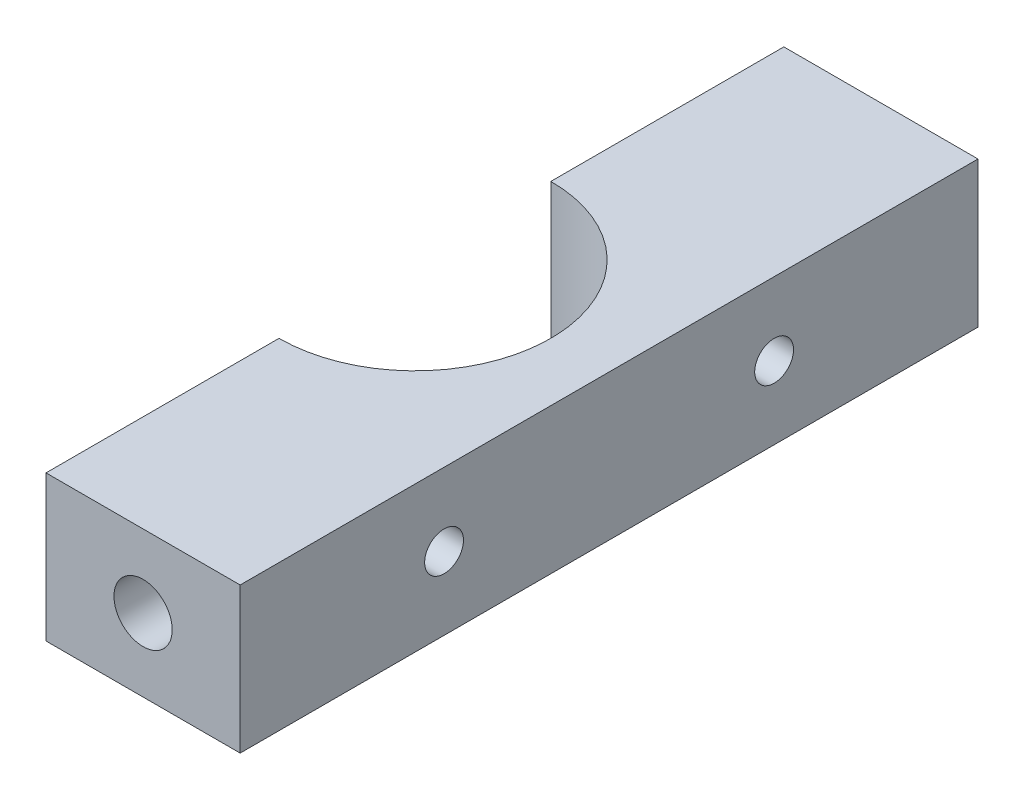
ISO-10303-21;
HEADER;
FILE_DESCRIPTION(('STEP AP214'),'2;1');
FILE_NAME('part.step','',(''),(''),'','','');
FILE_SCHEMA(('AUTOMOTIVE_DESIGN { 1 0 10303 214 1 1 1 1 }'));
ENDSEC;
DATA;
#1=APPLICATION_CONTEXT('core data for automotive mechanical design processes');
#2=APPLICATION_PROTOCOL_DEFINITION('international standard','automotive_design',2000,#1);
#3=PRODUCT_CONTEXT('',#1,'mechanical');
#4=PRODUCT('Part','Part','',(#3));
#5=PRODUCT_RELATED_PRODUCT_CATEGORY('part','',(#4));
#6=PRODUCT_DEFINITION_FORMATION('','',#4);
#7=PRODUCT_DEFINITION_CONTEXT('part definition',#1,'design');
#8=PRODUCT_DEFINITION('design','',#6,#7);
#9=PRODUCT_DEFINITION_SHAPE('','',#8);
#10=(LENGTH_UNIT() NAMED_UNIT(*) SI_UNIT(.MILLI.,.METRE.));
#11=(NAMED_UNIT(*) PLANE_ANGLE_UNIT() SI_UNIT($,.RADIAN.));
#12=(NAMED_UNIT(*) SI_UNIT($,.STERADIAN.) SOLID_ANGLE_UNIT());
#13=UNCERTAINTY_MEASURE_WITH_UNIT(LENGTH_MEASURE(1.E-05),#10,'distance_accuracy_value','');
#14=(GEOMETRIC_REPRESENTATION_CONTEXT(3) GLOBAL_UNCERTAINTY_ASSIGNED_CONTEXT((#13)) GLOBAL_UNIT_ASSIGNED_CONTEXT((#10,
#11,#12)) REPRESENTATION_CONTEXT('',''));
#15=CARTESIAN_POINT('',(0.,0.,0.));
#16=DIRECTION('',(0.,0.,1.));
#17=DIRECTION('',(1.,0.,0.));
#18=AXIS2_PLACEMENT_3D('',#15,#16,#17);
#19=CARTESIAN_POINT('',(20.0000999096368,15.,-38.0000000000109));
#20=DIRECTION('',(0.,0.,1.));
#21=DIRECTION('',(1.,0.,0.));
#22=AXIS2_PLACEMENT_3D('',#19,#20,#21);
#23=PLANE('',#22);
#24=DIRECTION('',(-1.,0.,0.));
#25=VECTOR('',#24,1.);
#26=CARTESIAN_POINT('',(20.0000999096368,0.,-38.0000000000109));
#27=LINE('',#26,#25);
#28=CARTESIAN_POINT('',(20.0000999096368,0.,-38.0000000000109));
#29=VERTEX_POINT('',#28);
#30=CARTESIAN_POINT('',(-4.94881913226664E-10,0.,-38.0000000000109));
#31=VERTEX_POINT('',#30);
#32=EDGE_CURVE('E124',#29,#31,#27,.T.);
#33=ORIENTED_EDGE('',*,*,#32,.T.);
#34=DIRECTION('',(0.,-1.,0.));
#35=VECTOR('',#34,1.);
#36=CARTESIAN_POINT('',(-4.94881913226664E-10,15.,-38.0000000000109));
#37=LINE('',#36,#35);
#38=CARTESIAN_POINT('',(-4.94881913226664E-10,15.,-38.0000000000109));
#39=VERTEX_POINT('',#38);
#40=EDGE_CURVE('E109',#39,#31,#37,.T.);
#41=ORIENTED_EDGE('',*,*,#40,.F.);
#42=DIRECTION('',(-1.,0.,0.));
#43=VECTOR('',#42,1.);
#44=CARTESIAN_POINT('',(20.0000999096368,15.,-38.0000000000109));
#45=LINE('',#44,#43);
#46=CARTESIAN_POINT('',(20.0000999096368,15.,-38.0000000000109));
#47=VERTEX_POINT('',#46);
#48=EDGE_CURVE('E100',#47,#39,#45,.T.);
#49=ORIENTED_EDGE('',*,*,#48,.F.);
#50=DIRECTION('',(0.,-1.,0.));
#51=VECTOR('',#50,1.);
#52=CARTESIAN_POINT('',(20.0000999096368,15.,-38.0000000000109));
#53=LINE('',#52,#51);
#54=EDGE_CURVE('E41',#47,#29,#53,.T.);
#55=ORIENTED_EDGE('',*,*,#54,.T.);
#56=EDGE_LOOP('',(#33,#41,#49,#55));
#57=FACE_BOUND('',#56,.T.);
#58=CARTESIAN_POINT('',(9.99999999950687,7.50000000000001,-38.0000000000109));
#59=DIRECTION('',(0.,0.,1.));
#60=DIRECTION('',(1.,0.,0.));
#61=AXIS2_PLACEMENT_3D('',#58,#59,#60);
#62=CIRCLE('',#61,3.);
#63=CARTESIAN_POINT('',(12.9999999995069,7.50000000000001,-38.0000000000109));
#64=VERTEX_POINT('',#63);
#65=EDGE_CURVE('E221',#64,#64,#62,.T.);
#66=ORIENTED_EDGE('',*,*,#65,.T.);
#67=EDGE_LOOP('',(#66));
#68=FACE_BOUND('',#67,.T.);
#69=ADVANCED_FACE('F31',(#57,#68),#23,.F.);
#70=CARTESIAN_POINT('',(-4.94895804792448E-10,15.,38.0000000000091));
#71=DIRECTION('',(0.,0.,-1.));
#72=DIRECTION('',(-1.,0.,0.));
#73=AXIS2_PLACEMENT_3D('',#70,#71,#72);
#74=PLANE('',#73);
#75=CARTESIAN_POINT('',(10.,7.5,38.0000000000091));
#76=DIRECTION('',(0.,0.,1.));
#77=DIRECTION('',(1.,0.,0.));
#78=AXIS2_PLACEMENT_3D('',#75,#76,#77);
#79=CIRCLE('',#78,3.);
#80=CARTESIAN_POINT('',(13.,7.5,38.0000000000091));
#81=VERTEX_POINT('',#80);
#82=EDGE_CURVE('E148',#81,#81,#79,.T.);
#83=ORIENTED_EDGE('',*,*,#82,.F.);
#84=EDGE_LOOP('',(#83));
#85=FACE_BOUND('',#84,.T.);
#86=DIRECTION('',(1.,0.,0.));
#87=VECTOR('',#86,1.);
#88=CARTESIAN_POINT('',(-4.94895804792448E-10,0.,38.0000000000091));
#89=LINE('',#88,#87);
#90=CARTESIAN_POINT('',(-4.94895804792448E-10,0.,38.0000000000091));
#91=VERTEX_POINT('',#90);
#92=CARTESIAN_POINT('',(20.0000999096368,0.,38.0000000000091));
#93=VERTEX_POINT('',#92);
#94=EDGE_CURVE('E118',#91,#93,#89,.T.);
#95=ORIENTED_EDGE('',*,*,#94,.T.);
#96=DIRECTION('',(0.,-1.,0.));
#97=VECTOR('',#96,1.);
#98=CARTESIAN_POINT('',(20.0000999096368,15.,38.0000000000091));
#99=LINE('',#98,#97);
#100=CARTESIAN_POINT('',(20.0000999096368,15.,38.0000000000091));
#101=VERTEX_POINT('',#100);
#102=EDGE_CURVE('E11',#101,#93,#99,.T.);
#103=ORIENTED_EDGE('',*,*,#102,.F.);
#104=DIRECTION('',(1.,0.,0.));
#105=VECTOR('',#104,1.);
#106=CARTESIAN_POINT('',(-4.94895804792448E-10,15.,38.0000000000091));
#107=LINE('',#106,#105);
#108=CARTESIAN_POINT('',(-4.94895804792448E-10,15.,38.0000000000091));
#109=VERTEX_POINT('',#108);
#110=EDGE_CURVE('E129',#109,#101,#107,.T.);
#111=ORIENTED_EDGE('',*,*,#110,.F.);
#112=DIRECTION('',(0.,-1.,0.));
#113=VECTOR('',#112,1.);
#114=CARTESIAN_POINT('',(-4.94895804792448E-10,15.,38.0000000000091));
#115=LINE('',#114,#113);
#116=EDGE_CURVE('E114',#109,#91,#115,.T.);
#117=ORIENTED_EDGE('',*,*,#116,.T.);
#118=EDGE_LOOP('',(#95,#103,#111,#117));
#119=FACE_BOUND('',#118,.T.);
#120=ADVANCED_FACE('F33',(#85,#119),#74,.F.);
#121=CARTESIAN_POINT('',(20.0000999096368,15.,38.0000000000091));
#122=DIRECTION('',(-1.,0.,0.));
#123=DIRECTION('',(0.,0.,1.));
#124=AXIS2_PLACEMENT_3D('',#121,#122,#123);
#125=PLANE('',#124);
#126=CARTESIAN_POINT('',(20.0000999096368,7.5,-17.0000000000113));
#127=DIRECTION('',(-1.,0.,0.));
#128=DIRECTION('',(0.,0.,1.));
#129=AXIS2_PLACEMENT_3D('',#126,#127,#128);
#130=CIRCLE('',#129,2.00000000001078);
#131=CARTESIAN_POINT('',(20.0000999096368,7.5,-19.000000000022));
#132=VERTEX_POINT('',#131);
#133=EDGE_CURVE('E136',#132,#132,#130,.T.);
#134=ORIENTED_EDGE('',*,*,#133,.T.);
#135=EDGE_LOOP('',(#134));
#136=FACE_BOUND('',#135,.T.);
#137=CARTESIAN_POINT('',(20.0000999096368,7.5,17.0000000000113));
#138=DIRECTION('',(-1.,0.,0.));
#139=DIRECTION('',(0.,0.,1.));
#140=AXIS2_PLACEMENT_3D('',#137,#138,#139);
#141=CIRCLE('',#140,2.00000000001079);
#142=CARTESIAN_POINT('',(20.0000999096368,7.5,15.0000000000005));
#143=VERTEX_POINT('',#142);
#144=EDGE_CURVE('E122',#143,#143,#141,.T.);
#145=ORIENTED_EDGE('',*,*,#144,.T.);
#146=EDGE_LOOP('',(#145));
#147=FACE_BOUND('',#146,.T.);
#148=DIRECTION('',(0.,0.,-1.));
#149=VECTOR('',#148,1.);
#150=CARTESIAN_POINT('',(20.0000999096368,0.,38.0000000000091));
#151=LINE('',#150,#149);
#152=EDGE_CURVE('E121',#93,#29,#151,.T.);
#153=ORIENTED_EDGE('',*,*,#152,.T.);
#154=ORIENTED_EDGE('',*,*,#54,.F.);
#155=DIRECTION('',(0.,0.,-1.));
#156=VECTOR('',#155,1.);
#157=CARTESIAN_POINT('',(20.0000999096368,15.,38.0000000000091));
#158=LINE('',#157,#156);
#159=EDGE_CURVE('E87',#101,#47,#158,.T.);
#160=ORIENTED_EDGE('',*,*,#159,.F.);
#161=ORIENTED_EDGE('',*,*,#102,.T.);
#162=EDGE_LOOP('',(#153,#154,#160,#161));
#163=FACE_BOUND('',#162,.T.);
#164=ADVANCED_FACE('F154',(#136,#147,#163),#125,.F.);
#165=CARTESIAN_POINT('',(-4.94881913226664E-10,15.,-38.0000000000109));
#166=DIRECTION('',(1.,0.,0.));
#167=DIRECTION('',(0.,0.,-1.));
#168=AXIS2_PLACEMENT_3D('',#165,#166,#167);
#169=PLANE('',#168);
#170=CARTESIAN_POINT('',(-4.94888852120567E-10,7.5,-17.0000000000113));
#171=DIRECTION('',(1.,0.,0.));
#172=DIRECTION('',(0.,0.,-1.));
#173=AXIS2_PLACEMENT_3D('',#170,#171,#172);
#174=CIRCLE('',#173,2.00000000001078);
#175=CARTESIAN_POINT('',(-4.94888852120567E-10,7.5,-19.000000000022));
#176=VERTEX_POINT('',#175);
#177=EDGE_CURVE('E35',#176,#176,#174,.T.);
#178=ORIENTED_EDGE('',*,*,#177,.T.);
#179=EDGE_LOOP('',(#178));
#180=FACE_BOUND('',#179,.T.);
#181=DIRECTION('',(0.,0.,1.));
#182=VECTOR('',#181,1.);
#183=CARTESIAN_POINT('',(-4.94881913226664E-10,0.,-38.0000000000109));
#184=LINE('',#183,#182);
#185=CARTESIAN_POINT('',(-4.94899015291471E-10,0.,-13.9999999999537));
#186=VERTEX_POINT('',#185);
#187=EDGE_CURVE('E108',#31,#186,#184,.T.);
#188=ORIENTED_EDGE('',*,*,#187,.T.);
#189=DIRECTION('',(0.,-1.,0.));
#190=VECTOR('',#189,1.);
#191=CARTESIAN_POINT('',(-4.94899015291471E-10,15.,-13.9999999999537));
#192=LINE('',#191,#190);
#193=CARTESIAN_POINT('',(-4.94899015291471E-10,15.,-13.9999999999537));
#194=VERTEX_POINT('',#193);
#195=EDGE_CURVE('E105',#194,#186,#192,.T.);
#196=ORIENTED_EDGE('',*,*,#195,.F.);
#197=DIRECTION('',(0.,0.,1.));
#198=VECTOR('',#197,1.);
#199=CARTESIAN_POINT('',(-4.94881913226664E-10,15.,-38.0000000000109));
#200=LINE('',#199,#198);
#201=EDGE_CURVE('E94',#39,#194,#200,.T.);
#202=ORIENTED_EDGE('',*,*,#201,.F.);
#203=ORIENTED_EDGE('',*,*,#40,.T.);
#204=EDGE_LOOP('',(#188,#196,#202,#203));
#205=FACE_BOUND('',#204,.T.);
#206=ADVANCED_FACE('F106',(#180,#205),#169,.F.);
#207=CARTESIAN_POINT('',(-4.1049535815979E-10,15.,-1.43973374888695E-11));
#208=DIRECTION('',(0.,-1.,0.));
#209=DIRECTION('',(0.,0.,-1.));
#210=AXIS2_PLACEMENT_3D('',#207,#208,#209);
#211=CYLINDRICAL_SURFACE('',#210,13.9999999999393);
#212=CARTESIAN_POINT('',(-4.1049535815979E-10,0.,-1.43973374888695E-11));
#213=DIRECTION('',(0.,-1.,0.));
#214=DIRECTION('',(0.,0.,1.));
#215=AXIS2_PLACEMENT_3D('',#212,#213,#214);
#216=CIRCLE('',#215,13.9999999999393);
#217=CARTESIAN_POINT('',(-4.94895804792448E-10,0.,13.9999999999249));
#218=VERTEX_POINT('',#217);
#219=EDGE_CURVE('E73',#186,#218,#216,.T.);
#220=ORIENTED_EDGE('',*,*,#219,.T.);
#221=DIRECTION('',(0.,-1.,0.));
#222=VECTOR('',#221,1.);
#223=CARTESIAN_POINT('',(-4.94895804792448E-10,15.,13.9999999999249));
#224=LINE('',#223,#222);
#225=CARTESIAN_POINT('',(-4.94895804792448E-10,15.,13.9999999999249));
#226=VERTEX_POINT('',#225);
#227=EDGE_CURVE('E110',#226,#218,#224,.T.);
#228=ORIENTED_EDGE('',*,*,#227,.F.);
#229=CARTESIAN_POINT('',(-4.1049535815979E-10,15.,-1.43973374888695E-11));
#230=DIRECTION('',(0.,-1.,0.));
#231=DIRECTION('',(0.,0.,1.));
#232=AXIS2_PLACEMENT_3D('',#229,#230,#231);
#233=CIRCLE('',#232,13.9999999999393);
#234=EDGE_CURVE('E98',#194,#226,#233,.T.);
#235=ORIENTED_EDGE('',*,*,#234,.F.);
#236=ORIENTED_EDGE('',*,*,#195,.T.);
#237=EDGE_LOOP('',(#220,#228,#235,#236));
#238=FACE_BOUND('',#237,.T.);
#239=ADVANCED_FACE('F112',(#238),#211,.F.);
#240=CARTESIAN_POINT('',(-4.94895804792448E-10,15.,13.9999999999249));
#241=DIRECTION('',(1.,0.,0.));
#242=DIRECTION('',(0.,0.,-1.));
#243=AXIS2_PLACEMENT_3D('',#240,#241,#242);
#244=PLANE('',#243);
#245=CARTESIAN_POINT('',(-4.94895791014471E-10,7.5,17.0000000000113));
#246=DIRECTION('',(1.,0.,0.));
#247=DIRECTION('',(0.,0.,-1.));
#248=AXIS2_PLACEMENT_3D('',#245,#246,#247);
#249=CIRCLE('',#248,2.00000000001079);
#250=CARTESIAN_POINT('',(-4.94902729908375E-10,7.5,15.0000000000005));
#251=VERTEX_POINT('',#250);
#252=EDGE_CURVE('E134',#251,#251,#249,.T.);
#253=ORIENTED_EDGE('',*,*,#252,.T.);
#254=EDGE_LOOP('',(#253));
#255=FACE_BOUND('',#254,.T.);
#256=DIRECTION('',(0.,0.,1.));
#257=VECTOR('',#256,1.);
#258=CARTESIAN_POINT('',(-4.94895804792448E-10,0.,13.9999999999249));
#259=LINE('',#258,#257);
#260=EDGE_CURVE('E79',#218,#91,#259,.T.);
#261=ORIENTED_EDGE('',*,*,#260,.T.);
#262=ORIENTED_EDGE('',*,*,#116,.F.);
#263=DIRECTION('',(0.,0.,1.));
#264=VECTOR('',#263,1.);
#265=CARTESIAN_POINT('',(-4.94895804792448E-10,15.,13.9999999999249));
#266=LINE('',#265,#264);
#267=EDGE_CURVE('E50',#226,#109,#266,.T.);
#268=ORIENTED_EDGE('',*,*,#267,.F.);
#269=ORIENTED_EDGE('',*,*,#227,.T.);
#270=EDGE_LOOP('',(#261,#262,#268,#269));
#271=FACE_BOUND('',#270,.T.);
#272=ADVANCED_FACE('F162',(#255,#271),#244,.F.);
#273=CARTESIAN_POINT('',(-4.1049535815979E-10,15.,-1.43973374888695E-11));
#274=DIRECTION('',(0.,1.,0.));
#275=DIRECTION('',(0.,0.,1.));
#276=AXIS2_PLACEMENT_3D('',#273,#274,#275);
#277=PLANE('',#276);
#278=ORIENTED_EDGE('',*,*,#110,.T.);
#279=ORIENTED_EDGE('',*,*,#159,.T.);
#280=ORIENTED_EDGE('',*,*,#48,.T.);
#281=ORIENTED_EDGE('',*,*,#201,.T.);
#282=ORIENTED_EDGE('',*,*,#234,.T.);
#283=ORIENTED_EDGE('',*,*,#267,.T.);
#284=EDGE_LOOP('',(#278,#279,#280,#281,#282,#283));
#285=FACE_BOUND('',#284,.T.);
#286=ADVANCED_FACE('F96',(#285),#277,.T.);
#287=CARTESIAN_POINT('',(-4.1049535815979E-10,0.,-1.43973374888695E-11));
#288=DIRECTION('',(0.,1.,0.));
#289=DIRECTION('',(0.,0.,1.));
#290=AXIS2_PLACEMENT_3D('',#287,#288,#289);
#291=PLANE('',#290);
#292=ORIENTED_EDGE('',*,*,#94,.F.);
#293=ORIENTED_EDGE('',*,*,#260,.F.);
#294=ORIENTED_EDGE('',*,*,#219,.F.);
#295=ORIENTED_EDGE('',*,*,#187,.F.);
#296=ORIENTED_EDGE('',*,*,#32,.F.);
#297=ORIENTED_EDGE('',*,*,#152,.F.);
#298=EDGE_LOOP('',(#292,#293,#294,#295,#296,#297));
#299=FACE_BOUND('',#298,.T.);
#300=ADVANCED_FACE('F160',(#299),#291,.F.);
#301=CARTESIAN_POINT('',(-40.9999000903632,7.5,17.0000000000113));
#302=DIRECTION('',(1.,0.,0.));
#303=DIRECTION('',(0.,0.,-1.));
#304=AXIS2_PLACEMENT_3D('',#301,#302,#303);
#305=CYLINDRICAL_SURFACE('',#304,2.00000000001079);
#306=CARTESIAN_POINT('',(-4.94902729908375E-10,7.5,15.0000000000005));
#307=CARTESIAN_POINT('',(0.20833437356897,7.5,15.0000000000005));
#308=CARTESIAN_POINT('',(0.416668747632842,7.5,15.0000000000005));
#309=CARTESIAN_POINT('',(0.833337495760586,7.5,15.0000000000005));
#310=CARTESIAN_POINT('',(1.04167186982446,7.5,15.0000000000005));
#311=CARTESIAN_POINT('',(1.4583406179522,7.5,15.0000000000005));
#312=CARTESIAN_POINT('',(1.66667499201608,7.5,15.0000000000005));
#313=CARTESIAN_POINT('',(2.08334374014382,7.5,15.0000000000005));
#314=CARTESIAN_POINT('',(2.29167811420769,7.5,15.0000000000005));
#315=CARTESIAN_POINT('',(2.70834686233544,7.5,15.0000000000005));
#316=CARTESIAN_POINT('',(2.91668123639931,7.5,15.0000000000005));
#317=CARTESIAN_POINT('',(3.33334998452705,7.5,15.0000000000005));
#318=CARTESIAN_POINT('',(3.54168435859093,7.5,15.0000000000005));
#319=CARTESIAN_POINT('',(3.95835310671867,7.5,15.0000000000005));
#320=CARTESIAN_POINT('',(4.16668748078254,7.5,15.0000000000005));
#321=CARTESIAN_POINT('',(4.58335622891029,7.5,15.0000000000005));
#322=CARTESIAN_POINT('',(4.79169060297416,7.5,15.0000000000005));
#323=CARTESIAN_POINT('',(5.2083593511019,7.5,15.0000000000005));
#324=CARTESIAN_POINT('',(5.41669372516578,7.5,15.0000000000005));
#325=CARTESIAN_POINT('',(5.83336247329352,7.5,15.0000000000005));
#326=CARTESIAN_POINT('',(6.04169684735739,7.5,15.0000000000005));
#327=CARTESIAN_POINT('',(6.45836559548514,7.5,15.0000000000005));
#328=CARTESIAN_POINT('',(6.66669996954901,7.5,15.0000000000005));
#329=CARTESIAN_POINT('',(7.08336871767676,7.5,15.0000000000005));
#330=CARTESIAN_POINT('',(7.29170309174063,7.5,15.0000000000005));
#331=CARTESIAN_POINT('',(7.70837183986837,7.5,15.0000000000005));
#332=CARTESIAN_POINT('',(7.91670621393224,7.5,15.0000000000005));
#333=CARTESIAN_POINT('',(8.33337496205999,7.5,15.0000000000005));
#334=CARTESIAN_POINT('',(8.54170933612386,7.5,15.0000000000005));
#335=CARTESIAN_POINT('',(8.95837808425161,7.5,15.0000000000005));
#336=CARTESIAN_POINT('',(9.16671245831548,7.5,15.0000000000005));
#337=CARTESIAN_POINT('',(9.58338120644322,7.5,15.0000000000005));
#338=CARTESIAN_POINT('',(9.79171558050709,7.5,15.0000000000005));
#339=CARTESIAN_POINT('',(10.2083843286348,7.5,15.0000000000005));
#340=CARTESIAN_POINT('',(10.4167187026987,7.5,15.0000000000005));
#341=CARTESIAN_POINT('',(10.8333874508265,7.5,15.0000000000005));
#342=CARTESIAN_POINT('',(11.0417218248903,7.5,15.0000000000005));
#343=CARTESIAN_POINT('',(11.4583905730181,7.5,15.0000000000005));
#344=CARTESIAN_POINT('',(11.6667249470819,7.5,15.0000000000005));
#345=CARTESIAN_POINT('',(12.0833936952097,7.5,15.0000000000005));
#346=CARTESIAN_POINT('',(12.2917280692736,7.5,15.0000000000005));
#347=CARTESIAN_POINT('',(12.7083968174013,7.5,15.0000000000005));
#348=CARTESIAN_POINT('',(12.9167311914652,7.5,15.0000000000005));
#349=CARTESIAN_POINT('',(13.3333999395929,7.5,15.0000000000005));
#350=CARTESIAN_POINT('',(13.5417343136568,7.5,15.0000000000005));
#351=CARTESIAN_POINT('',(13.9584030617845,7.5,15.0000000000005));
#352=CARTESIAN_POINT('',(14.1667374358484,7.5,15.0000000000005));
#353=CARTESIAN_POINT('',(14.5834061839762,7.5,15.0000000000005));
#354=CARTESIAN_POINT('',(14.79174055804,7.5,15.0000000000005));
#355=CARTESIAN_POINT('',(15.2084093061678,7.5,15.0000000000005));
#356=CARTESIAN_POINT('',(15.4167436802316,7.5,15.0000000000005));
#357=CARTESIAN_POINT('',(15.8334124283594,7.5,15.0000000000005));
#358=CARTESIAN_POINT('',(16.0417468024233,7.5,15.0000000000005));
#359=CARTESIAN_POINT('',(16.458415550551,7.5,15.0000000000005));
#360=CARTESIAN_POINT('',(16.6667499246149,7.5,15.0000000000005));
#361=CARTESIAN_POINT('',(17.0834186727426,7.5,15.0000000000005));
#362=CARTESIAN_POINT('',(17.2917530468065,7.5,15.0000000000005));
#363=CARTESIAN_POINT('',(17.7084217949342,7.5,15.0000000000005));
#364=CARTESIAN_POINT('',(17.9167561689981,7.5,15.0000000000005));
#365=CARTESIAN_POINT('',(18.3334249171259,7.5,15.0000000000005));
#366=CARTESIAN_POINT('',(18.5417592911897,7.5,15.0000000000005));
#367=CARTESIAN_POINT('',(18.9584280393175,7.5,15.0000000000005));
#368=CARTESIAN_POINT('',(19.1667624133813,7.5,15.0000000000005));
#369=CARTESIAN_POINT('',(19.5834311615091,7.5,15.0000000000005));
#370=CARTESIAN_POINT('',(19.791765535573,7.5,15.0000000000005));
#371=CARTESIAN_POINT('',(20.0000999096368,7.5,15.0000000000005));
#372=B_SPLINE_CURVE_WITH_KNOTS('',3,(#306,#307,#308,#309,#310,#311,#312,#313,#314,#315,#316,
#317,#318,#319,#320,#321,#322,#323,#324,#325,#326,#327,#328,#329,#330,#331,#332,#333,#334,#335,
#336,#337,#338,#339,#340,#341,#342,#343,#344,#345,#346,#347,#348,#349,#350,#351,#352,#353,#354,
#355,#356,#357,#358,#359,#360,#361,#362,#363,#364,#365,#366,#367,#368,#369,#370,#371),
.UNSPECIFIED.,.F.,.F.,(4,2,2,2,2,2,2,2,2,2,2,2,2,2,2,2,2,2,2,2,2,2,2,2,2,2,2,2,2,2,2,2,4),(0.,
0.625003122191617,1.25000624438323,1.87500936657485,2.50001248876647,3.12501561095808,
3.7500187331497,4.37502185534132,5.00002497753294,5.62502809972455,6.25003122191617,
6.87503434410779,7.5000374662994,8.12504058849102,8.75004371068264,9.37504683287425,
10.0000499550659,10.6250530772575,11.2500561994491,11.8750593216407,12.5000624438323,
13.125065566024,13.7500686882156,14.3750718104072,15.0000749325988,15.6250780547904,
16.250081176982,16.8750842991737,17.5000874213653,18.1250905435569,18.7500936657485,
19.3750967879401,20.0000999101317),.UNSPECIFIED.);
#373=EDGE_CURVE('BSEAM189',#251,#143,#372,.T.);
#374=ORIENTED_EDGE('',*,*,#252,.F.);
#375=ORIENTED_EDGE('',*,*,#144,.F.);
#376=ORIENTED_EDGE('',*,*,#373,.T.);
#377=ORIENTED_EDGE('',*,*,#373,.F.);
#378=EDGE_LOOP('',(#374,#376,#375,#377));
#379=FACE_BOUND('',#378,.T.);
#380=ADVANCED_FACE('F189',(#379),#305,.F.);
#381=CARTESIAN_POINT('',(-40.9999000903632,7.5,-17.0000000000113));
#382=DIRECTION('',(1.,0.,0.));
#383=DIRECTION('',(0.,0.,-1.));
#384=AXIS2_PLACEMENT_3D('',#381,#382,#383);
#385=CYLINDRICAL_SURFACE('',#384,2.00000000001078);
#386=CARTESIAN_POINT('',(-4.94888852120567E-10,7.5,-19.000000000022));
#387=CARTESIAN_POINT('',(0.208334373568984,7.5,-19.000000000022));
#388=CARTESIAN_POINT('',(0.416668747632856,7.5,-19.000000000022));
#389=CARTESIAN_POINT('',(0.8333374957606,7.5,-19.000000000022));
#390=CARTESIAN_POINT('',(1.04167186982447,7.5,-19.000000000022));
#391=CARTESIAN_POINT('',(1.45834061795222,7.5,-19.000000000022));
#392=CARTESIAN_POINT('',(1.66667499201609,7.5,-19.000000000022));
#393=CARTESIAN_POINT('',(2.08334374014383,7.5,-19.000000000022));
#394=CARTESIAN_POINT('',(2.29167811420771,7.5,-19.000000000022));
#395=CARTESIAN_POINT('',(2.70834686233545,7.5,-19.000000000022));
#396=CARTESIAN_POINT('',(2.91668123639932,7.5,-19.000000000022));
#397=CARTESIAN_POINT('',(3.33334998452707,7.5,-19.000000000022));
#398=CARTESIAN_POINT('',(3.54168435859094,7.5,-19.000000000022));
#399=CARTESIAN_POINT('',(3.95835310671868,7.5,-19.000000000022));
#400=CARTESIAN_POINT('',(4.16668748078256,7.5,-19.000000000022));
#401=CARTESIAN_POINT('',(4.5833562289103,7.5,-19.000000000022));
#402=CARTESIAN_POINT('',(4.79169060297417,7.5,-19.000000000022));
#403=CARTESIAN_POINT('',(5.20835935110192,7.5,-19.000000000022));
#404=CARTESIAN_POINT('',(5.41669372516579,7.5,-19.000000000022));
#405=CARTESIAN_POINT('',(5.83336247329353,7.5,-19.000000000022));
#406=CARTESIAN_POINT('',(6.0416968473574,7.5,-19.000000000022));
#407=CARTESIAN_POINT('',(6.45836559548515,7.5,-19.000000000022));
#408=CARTESIAN_POINT('',(6.66669996954902,7.5,-19.000000000022));
#409=CARTESIAN_POINT('',(7.08336871767676,7.5,-19.000000000022));
#410=CARTESIAN_POINT('',(7.29170309174063,7.5,-19.000000000022));
#411=CARTESIAN_POINT('',(7.70837183986838,7.5,-19.000000000022));
#412=CARTESIAN_POINT('',(7.91670621393225,7.5,-19.000000000022));
#413=CARTESIAN_POINT('',(8.33337496206,7.5,-19.000000000022));
#414=CARTESIAN_POINT('',(8.54170933612387,7.5,-19.000000000022));
#415=CARTESIAN_POINT('',(8.95837808425161,7.5,-19.000000000022));
#416=CARTESIAN_POINT('',(9.16671245831549,7.5,-19.000000000022));
#417=CARTESIAN_POINT('',(9.58338120644323,7.5,-19.000000000022));
#418=CARTESIAN_POINT('',(9.7917155805071,7.5,-19.000000000022));
#419=CARTESIAN_POINT('',(10.2083843286348,7.5,-19.000000000022));
#420=CARTESIAN_POINT('',(10.4167187026987,7.5,-19.000000000022));
#421=CARTESIAN_POINT('',(10.8333874508265,7.5,-19.000000000022));
#422=CARTESIAN_POINT('',(11.0417218248903,7.5,-19.000000000022));
#423=CARTESIAN_POINT('',(11.4583905730181,7.5,-19.000000000022));
#424=CARTESIAN_POINT('',(11.666724947082,7.5,-19.000000000022));
#425=CARTESIAN_POINT('',(12.0833936952097,7.5,-19.000000000022));
#426=CARTESIAN_POINT('',(12.2917280692736,7.5,-19.000000000022));
#427=CARTESIAN_POINT('',(12.7083968174013,7.5,-19.000000000022));
#428=CARTESIAN_POINT('',(12.9167311914652,7.5,-19.000000000022));
#429=CARTESIAN_POINT('',(13.3333999395929,7.5,-19.000000000022));
#430=CARTESIAN_POINT('',(13.5417343136568,7.5,-19.000000000022));
#431=CARTESIAN_POINT('',(13.9584030617845,7.5,-19.000000000022));
#432=CARTESIAN_POINT('',(14.1667374358484,7.5,-19.000000000022));
#433=CARTESIAN_POINT('',(14.5834061839762,7.5,-19.000000000022));
#434=CARTESIAN_POINT('',(14.79174055804,7.5,-19.000000000022));
#435=CARTESIAN_POINT('',(15.2084093061678,7.5,-19.000000000022));
#436=CARTESIAN_POINT('',(15.4167436802316,7.5,-19.000000000022));
#437=CARTESIAN_POINT('',(15.8334124283594,7.5,-19.000000000022));
#438=CARTESIAN_POINT('',(16.0417468024233,7.5,-19.000000000022));
#439=CARTESIAN_POINT('',(16.458415550551,7.5,-19.000000000022));
#440=CARTESIAN_POINT('',(16.6667499246149,7.5,-19.000000000022));
#441=CARTESIAN_POINT('',(17.0834186727426,7.5,-19.000000000022));
#442=CARTESIAN_POINT('',(17.2917530468065,7.5,-19.000000000022));
#443=CARTESIAN_POINT('',(17.7084217949342,7.5,-19.000000000022));
#444=CARTESIAN_POINT('',(17.9167561689981,7.5,-19.000000000022));
#445=CARTESIAN_POINT('',(18.3334249171259,7.5,-19.000000000022));
#446=CARTESIAN_POINT('',(18.5417592911897,7.5,-19.000000000022));
#447=CARTESIAN_POINT('',(18.9584280393175,7.5,-19.000000000022));
#448=CARTESIAN_POINT('',(19.1667624133813,7.5,-19.000000000022));
#449=CARTESIAN_POINT('',(19.5834311615091,7.5,-19.000000000022));
#450=CARTESIAN_POINT('',(19.791765535573,7.5,-19.000000000022));
#451=CARTESIAN_POINT('',(20.0000999096368,7.5,-19.000000000022));
#452=B_SPLINE_CURVE_WITH_KNOTS('',3,(#386,#387,#388,#389,#390,#391,#392,#393,#394,#395,#396,
#397,#398,#399,#400,#401,#402,#403,#404,#405,#406,#407,#408,#409,#410,#411,#412,#413,#414,#415,
#416,#417,#418,#419,#420,#421,#422,#423,#424,#425,#426,#427,#428,#429,#430,#431,#432,#433,#434,
#435,#436,#437,#438,#439,#440,#441,#442,#443,#444,#445,#446,#447,#448,#449,#450,#451),
.UNSPECIFIED.,.F.,.F.,(4,2,2,2,2,2,2,2,2,2,2,2,2,2,2,2,2,2,2,2,2,2,2,2,2,2,2,2,2,2,2,2,4),(0.,
0.625003122191617,1.25000624438323,1.87500936657485,2.50001248876647,3.12501561095808,
3.7500187331497,4.37502185534132,5.00002497753294,5.62502809972455,6.25003122191616,
6.87503434410778,7.5000374662994,8.12504058849101,8.75004371068263,9.37504683287425,
10.0000499550659,10.6250530772575,11.2500561994491,11.8750593216407,12.5000624438323,
13.1250655660239,13.7500686882156,14.3750718104072,15.0000749325988,15.6250780547904,
16.250081176982,16.8750842991736,17.5000874213653,18.1250905435569,18.7500936657485,
19.3750967879401,20.0000999101317),.UNSPECIFIED.);
#453=EDGE_CURVE('BSEAM191',#176,#132,#452,.T.);
#454=ORIENTED_EDGE('',*,*,#177,.F.);
#455=ORIENTED_EDGE('',*,*,#133,.F.);
#456=ORIENTED_EDGE('',*,*,#453,.T.);
#457=ORIENTED_EDGE('',*,*,#453,.F.);
#458=EDGE_LOOP('',(#454,#456,#455,#457));
#459=FACE_BOUND('',#458,.T.);
#460=ADVANCED_FACE('F191',(#459),#385,.F.);
#461=CARTESIAN_POINT('',(10.,7.5,21.0000000000091));
#462=DIRECTION('',(0.,0.,1.));
#463=DIRECTION('',(1.,0.,0.));
#464=AXIS2_PLACEMENT_3D('',#461,#462,#463);
#465=CYLINDRICAL_SURFACE('',#464,3.);
#466=CARTESIAN_POINT('',(10.,7.5,21.0000000000091));
#467=DIRECTION('',(0.,0.,1.));
#468=DIRECTION('',(1.,0.,0.));
#469=AXIS2_PLACEMENT_3D('',#466,#467,#468);
#470=CIRCLE('',#469,3.);
#471=CARTESIAN_POINT('',(13.,7.5,21.0000000000091));
#472=VERTEX_POINT('',#471);
#473=EDGE_CURVE('E146',#472,#472,#470,.T.);
#474=ORIENTED_EDGE('',*,*,#473,.F.);
#475=EDGE_LOOP('',(#474));
#476=FACE_BOUND('',#475,.T.);
#477=ORIENTED_EDGE('',*,*,#82,.T.);
#478=EDGE_LOOP('',(#477));
#479=FACE_BOUND('',#478,.T.);
#480=ADVANCED_FACE('F198',(#476,#479),#465,.F.);
#481=CARTESIAN_POINT('',(10.,7.5,21.0000000000091));
#482=DIRECTION('',(0.,0.,1.));
#483=DIRECTION('',(1.,0.,0.));
#484=AXIS2_PLACEMENT_3D('',#481,#482,#483);
#485=PLANE('',#484);
#486=ORIENTED_EDGE('',*,*,#473,.T.);
#487=EDGE_LOOP('',(#486));
#488=FACE_BOUND('',#487,.T.);
#489=ADVANCED_FACE('F204',(#488),#485,.T.);
#490=CARTESIAN_POINT('',(9.99999999950687,7.50000000000001,-21.0000000000109));
#491=DIRECTION('',(0.,0.,-1.));
#492=DIRECTION('',(-1.,0.,0.));
#493=AXIS2_PLACEMENT_3D('',#490,#491,#492);
#494=CYLINDRICAL_SURFACE('',#493,3.);
#495=CARTESIAN_POINT('',(9.99999999950687,7.50000000000001,-21.0000000000109));
#496=DIRECTION('',(0.,0.,1.));
#497=DIRECTION('',(1.,0.,0.));
#498=AXIS2_PLACEMENT_3D('',#495,#496,#497);
#499=CIRCLE('',#498,3.);
#500=CARTESIAN_POINT('',(12.9999999995069,7.50000000000001,-21.0000000000109));
#501=VERTEX_POINT('',#500);
#502=EDGE_CURVE('E220',#501,#501,#499,.T.);
#503=ORIENTED_EDGE('',*,*,#502,.T.);
#504=EDGE_LOOP('',(#503));
#505=FACE_BOUND('',#504,.T.);
#506=ORIENTED_EDGE('',*,*,#65,.F.);
#507=EDGE_LOOP('',(#506));
#508=FACE_BOUND('',#507,.T.);
#509=ADVANCED_FACE('F208',(#505,#508),#494,.F.);
#510=CARTESIAN_POINT('',(9.99999999950687,7.50000000000001,-21.0000000000109));
#511=DIRECTION('',(0.,0.,1.));
#512=DIRECTION('',(1.,0.,0.));
#513=AXIS2_PLACEMENT_3D('',#510,#511,#512);
#514=PLANE('',#513);
#515=ORIENTED_EDGE('',*,*,#502,.F.);
#516=EDGE_LOOP('',(#515));
#517=FACE_BOUND('',#516,.T.);
#518=ADVANCED_FACE('F212',(#517),#514,.F.);
#519=CLOSED_SHELL('',(#69,#120,#164,#206,#239,#272,#286,#300,#380,#460,#480,#489,#509,#518));
#520=MANIFOLD_SOLID_BREP('B2',#519);
#521=ADVANCED_BREP_SHAPE_REPRESENTATION('',(#18,#520),#14);
#522=SHAPE_DEFINITION_REPRESENTATION(#9,#521);
ENDSEC;
END-ISO-10303-21;
